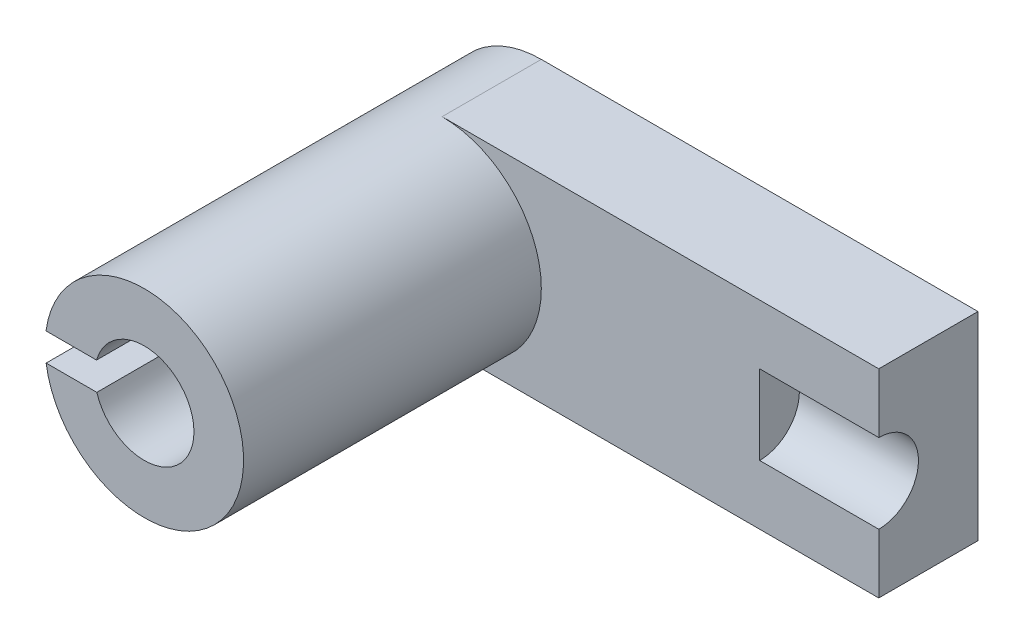
ISO-10303-21;
HEADER;
FILE_DESCRIPTION(('STEP AP214'),'2;1');
FILE_NAME('part.step','',(''),(''),'','','');
FILE_SCHEMA(('AUTOMOTIVE_DESIGN { 1 0 10303 214 1 1 1 1 }'));
ENDSEC;
DATA;
#1=APPLICATION_CONTEXT('core data for automotive mechanical design processes');
#2=APPLICATION_PROTOCOL_DEFINITION('international standard','automotive_design',2000,#1);
#3=PRODUCT_CONTEXT('',#1,'mechanical');
#4=PRODUCT('Part','Part','',(#3));
#5=PRODUCT_RELATED_PRODUCT_CATEGORY('part','',(#4));
#6=PRODUCT_DEFINITION_FORMATION('','',#4);
#7=PRODUCT_DEFINITION_CONTEXT('part definition',#1,'design');
#8=PRODUCT_DEFINITION('design','',#6,#7);
#9=PRODUCT_DEFINITION_SHAPE('','',#8);
#10=(LENGTH_UNIT() NAMED_UNIT(*) SI_UNIT(.MILLI.,.METRE.));
#11=(NAMED_UNIT(*) PLANE_ANGLE_UNIT() SI_UNIT($,.RADIAN.));
#12=(NAMED_UNIT(*) SI_UNIT($,.STERADIAN.) SOLID_ANGLE_UNIT());
#13=UNCERTAINTY_MEASURE_WITH_UNIT(LENGTH_MEASURE(1.E-05),#10,'distance_accuracy_value','');
#14=(GEOMETRIC_REPRESENTATION_CONTEXT(3) GLOBAL_UNCERTAINTY_ASSIGNED_CONTEXT((#13)) GLOBAL_UNIT_ASSIGNED_CONTEXT((#10,
#11,#12)) REPRESENTATION_CONTEXT('',''));
#15=CARTESIAN_POINT('',(0.,0.,0.));
#16=DIRECTION('',(0.,0.,1.));
#17=DIRECTION('',(1.,0.,0.));
#18=AXIS2_PLACEMENT_3D('',#15,#16,#17);
#19=CARTESIAN_POINT('',(-110.,25.,0.));
#20=DIRECTION('',(0.,1.,0.));
#21=DIRECTION('',(0.,0.,1.));
#22=AXIS2_PLACEMENT_3D('',#19,#20,#21);
#23=PLANE('',#22);
#24=DIRECTION('',(0.,0.,1.));
#25=VECTOR('',#24,1.);
#26=CARTESIAN_POINT('',(0.,25.,0.));
#27=LINE('',#26,#25);
#28=CARTESIAN_POINT('',(0.,25.,-12.5));
#29=VERTEX_POINT('',#28);
#30=CARTESIAN_POINT('',(0.,25.,12.5));
#31=VERTEX_POINT('',#30);
#32=EDGE_CURVE('E158',#29,#31,#27,.T.);
#33=ORIENTED_EDGE('',*,*,#32,.F.);
#34=DIRECTION('',(1.,0.,0.));
#35=VECTOR('',#34,1.);
#36=CARTESIAN_POINT('',(-110.,25.,-12.5));
#37=LINE('',#36,#35);
#38=CARTESIAN_POINT('',(-110.,25.,-12.5));
#39=VERTEX_POINT('',#38);
#40=EDGE_CURVE('E175',#39,#29,#37,.T.);
#41=ORIENTED_EDGE('',*,*,#40,.F.);
#42=DIRECTION('',(0.,0.,1.));
#43=VECTOR('',#42,1.);
#44=CARTESIAN_POINT('',(-110.,25.,0.));
#45=LINE('',#44,#43);
#46=CARTESIAN_POINT('',(-110.,25.,12.5));
#47=VERTEX_POINT('',#46);
#48=EDGE_CURVE('E159',#39,#47,#45,.T.);
#49=ORIENTED_EDGE('',*,*,#48,.T.);
#50=DIRECTION('',(1.,0.,0.));
#51=VECTOR('',#50,1.);
#52=CARTESIAN_POINT('',(-110.,25.,12.5));
#53=LINE('',#52,#51);
#54=EDGE_CURVE('E165',#47,#31,#53,.T.);
#55=ORIENTED_EDGE('',*,*,#54,.T.);
#56=EDGE_LOOP('',(#33,#41,#49,#55));
#57=FACE_BOUND('',#56,.T.);
#58=ADVANCED_FACE('F41',(#57),#23,.T.);
#59=CARTESIAN_POINT('',(-110.,0.,-12.5));
#60=DIRECTION('',(0.,0.,1.));
#61=DIRECTION('',(0.,-1.,0.));
#62=AXIS2_PLACEMENT_3D('',#59,#60,#61);
#63=PLANE('',#62);
#64=CARTESIAN_POINT('',(-110.,0.,-12.5));
#65=DIRECTION('',(0.,0.,-1.));
#66=DIRECTION('',(0.,1.,0.));
#67=AXIS2_PLACEMENT_3D('',#64,#65,#66);
#68=CIRCLE('',#67,12.5);
#69=CARTESIAN_POINT('',(-122.033532760525,3.38291136469196,-12.5));
#70=VERTEX_POINT('',#69);
#71=CARTESIAN_POINT('',(-121.965227528314,-3.61708863530804,-12.5));
#72=VERTEX_POINT('',#71);
#73=EDGE_CURVE('E189',#70,#72,#68,.T.);
#74=ORIENTED_EDGE('',*,*,#73,.F.);
#75=DIRECTION('',(-1.,0.,0.));
#76=VECTOR('',#75,1.);
#77=CARTESIAN_POINT('',(-110.,3.38291136469196,-12.5));
#78=LINE('',#77,#76);
#79=CARTESIAN_POINT('',(-134.770060773011,3.38291136469196,-12.5));
#80=VERTEX_POINT('',#79);
#81=EDGE_CURVE('E122',#70,#80,#78,.T.);
#82=ORIENTED_EDGE('',*,*,#81,.T.);
#83=CARTESIAN_POINT('',(-110.,0.,-12.5));
#84=DIRECTION('',(0.,0.,-1.));
#85=DIRECTION('',(0.,1.,0.));
#86=AXIS2_PLACEMENT_3D('',#83,#84,#85);
#87=CIRCLE('',#86,25.);
#88=EDGE_CURVE('E138',#80,#39,#87,.T.);
#89=ORIENTED_EDGE('',*,*,#88,.T.);
#90=ORIENTED_EDGE('',*,*,#40,.T.);
#91=DIRECTION('',(0.,-1.,0.));
#92=VECTOR('',#91,1.);
#93=CARTESIAN_POINT('',(0.,0.,-12.5));
#94=LINE('',#93,#92);
#95=CARTESIAN_POINT('',(0.,-25.,-12.5));
#96=VERTEX_POINT('',#95);
#97=EDGE_CURVE('E163',#29,#96,#94,.T.);
#98=ORIENTED_EDGE('',*,*,#97,.T.);
#99=DIRECTION('',(1.,0.,0.));
#100=VECTOR('',#99,1.);
#101=CARTESIAN_POINT('',(-110.,-25.,-12.5));
#102=LINE('',#101,#100);
#103=CARTESIAN_POINT('',(-110.,-25.,-12.5));
#104=VERTEX_POINT('',#103);
#105=EDGE_CURVE('E136',#104,#96,#102,.T.);
#106=ORIENTED_EDGE('',*,*,#105,.F.);
#107=CARTESIAN_POINT('',(-134.736949484614,-3.61708863530804,-12.5));
#108=VERTEX_POINT('',#107);
#109=EDGE_CURVE('E130',#104,#108,#87,.T.);
#110=ORIENTED_EDGE('',*,*,#109,.T.);
#111=DIRECTION('',(1.,0.,0.));
#112=VECTOR('',#111,1.);
#113=CARTESIAN_POINT('',(-142.203850694216,-3.61708863530804,-12.5));
#114=LINE('',#113,#112);
#115=EDGE_CURVE('E115',#108,#72,#114,.T.);
#116=ORIENTED_EDGE('',*,*,#115,.T.);
#117=EDGE_LOOP('',(#74,#82,#89,#90,#98,#106,#110,#116));
#118=FACE_BOUND('',#117,.T.);
#119=ADVANCED_FACE('F134',(#118),#63,.F.);
#120=CARTESIAN_POINT('',(-110.,-25.,0.));
#121=DIRECTION('',(0.,1.,0.));
#122=DIRECTION('',(0.,0.,1.));
#123=AXIS2_PLACEMENT_3D('',#120,#121,#122);
#124=PLANE('',#123);
#125=DIRECTION('',(0.,0.,1.));
#126=VECTOR('',#125,1.);
#127=CARTESIAN_POINT('',(0.,-25.,0.));
#128=LINE('',#127,#126);
#129=CARTESIAN_POINT('',(0.,-25.,12.5));
#130=VERTEX_POINT('',#129);
#131=EDGE_CURVE('E171',#96,#130,#128,.T.);
#132=ORIENTED_EDGE('',*,*,#131,.T.);
#133=DIRECTION('',(1.,0.,0.));
#134=VECTOR('',#133,1.);
#135=CARTESIAN_POINT('',(-110.,-25.,12.5));
#136=LINE('',#135,#134);
#137=CARTESIAN_POINT('',(-110.,-25.,12.5));
#138=VERTEX_POINT('',#137);
#139=EDGE_CURVE('E179',#138,#130,#136,.T.);
#140=ORIENTED_EDGE('',*,*,#139,.F.);
#141=DIRECTION('',(0.,0.,1.));
#142=VECTOR('',#141,1.);
#143=CARTESIAN_POINT('',(-110.,-25.,0.));
#144=LINE('',#143,#142);
#145=EDGE_CURVE('E162',#104,#138,#144,.T.);
#146=ORIENTED_EDGE('',*,*,#145,.F.);
#147=ORIENTED_EDGE('',*,*,#105,.T.);
#148=EDGE_LOOP('',(#132,#140,#146,#147));
#149=FACE_BOUND('',#148,.T.);
#150=ADVANCED_FACE('F213',(#149),#124,.F.);
#151=CARTESIAN_POINT('',(-110.,0.,12.5));
#152=DIRECTION('',(0.,0.,1.));
#153=DIRECTION('',(0.,-1.,0.));
#154=AXIS2_PLACEMENT_3D('',#151,#152,#153);
#155=PLANE('',#154);
#156=CARTESIAN_POINT('',(-110.,0.,12.5));
#157=DIRECTION('',(0.,0.,1.));
#158=DIRECTION('',(0.,-1.,0.));
#159=AXIS2_PLACEMENT_3D('',#156,#157,#158);
#160=CIRCLE('',#159,25.);
#161=EDGE_CURVE('E140',#138,#47,#160,.T.);
#162=ORIENTED_EDGE('',*,*,#161,.F.);
#163=ORIENTED_EDGE('',*,*,#139,.T.);
#164=DIRECTION('',(0.,-1.,0.));
#165=VECTOR('',#164,1.);
#166=CARTESIAN_POINT('',(0.,0.,12.5));
#167=LINE('',#166,#165);
#168=CARTESIAN_POINT('',(0.,-10.,12.5));
#169=VERTEX_POINT('',#168);
#170=EDGE_CURVE('E168',#169,#130,#167,.T.);
#171=ORIENTED_EDGE('',*,*,#170,.F.);
#172=DIRECTION('',(1.,0.,0.));
#173=VECTOR('',#172,1.);
#174=CARTESIAN_POINT('',(-30.,-10.,12.5));
#175=LINE('',#174,#173);
#176=CARTESIAN_POINT('',(-30.,-10.,12.5));
#177=VERTEX_POINT('',#176);
#178=EDGE_CURVE('E156',#177,#169,#175,.T.);
#179=ORIENTED_EDGE('',*,*,#178,.F.);
#180=DIRECTION('',(0.,-1.,0.));
#181=VECTOR('',#180,1.);
#182=CARTESIAN_POINT('',(-30.,-10.,12.5));
#183=LINE('',#182,#181);
#184=CARTESIAN_POINT('',(-30.,10.,12.5));
#185=VERTEX_POINT('',#184);
#186=EDGE_CURVE('E150',#185,#177,#183,.T.);
#187=ORIENTED_EDGE('',*,*,#186,.F.);
#188=DIRECTION('',(1.,0.,0.));
#189=VECTOR('',#188,1.);
#190=CARTESIAN_POINT('',(-30.,10.,12.5));
#191=LINE('',#190,#189);
#192=CARTESIAN_POINT('',(0.,10.,12.5));
#193=VERTEX_POINT('',#192);
#194=EDGE_CURVE('E153',#185,#193,#191,.T.);
#195=ORIENTED_EDGE('',*,*,#194,.T.);
#196=EDGE_CURVE('E170',#31,#193,#167,.T.);
#197=ORIENTED_EDGE('',*,*,#196,.F.);
#198=ORIENTED_EDGE('',*,*,#54,.F.);
#199=EDGE_LOOP('',(#162,#163,#171,#179,#187,#195,#197,#198));
#200=FACE_BOUND('',#199,.T.);
#201=ADVANCED_FACE('F215',(#200),#155,.T.);
#202=CARTESIAN_POINT('',(0.,0.,0.));
#203=DIRECTION('',(1.,0.,0.));
#204=DIRECTION('',(0.,0.,-1.));
#205=AXIS2_PLACEMENT_3D('',#202,#203,#204);
#206=PLANE('',#205);
#207=CARTESIAN_POINT('',(0.,0.,12.5));
#208=DIRECTION('',(1.,0.,0.));
#209=DIRECTION('',(0.,0.,-1.));
#210=AXIS2_PLACEMENT_3D('',#207,#208,#209);
#211=CIRCLE('',#210,10.);
#212=EDGE_CURVE('E177',#169,#193,#211,.T.);
#213=ORIENTED_EDGE('',*,*,#212,.F.);
#214=ORIENTED_EDGE('',*,*,#170,.T.);
#215=ORIENTED_EDGE('',*,*,#131,.F.);
#216=ORIENTED_EDGE('',*,*,#97,.F.);
#217=ORIENTED_EDGE('',*,*,#32,.T.);
#218=ORIENTED_EDGE('',*,*,#196,.T.);
#219=EDGE_LOOP('',(#213,#214,#215,#216,#217,#218));
#220=FACE_BOUND('',#219,.T.);
#221=ADVANCED_FACE('F208',(#220),#206,.T.);
#222=CARTESIAN_POINT('',(-30.,0.,12.5));
#223=DIRECTION('',(1.,0.,0.));
#224=DIRECTION('',(0.,0.,-1.));
#225=AXIS2_PLACEMENT_3D('',#222,#223,#224);
#226=CYLINDRICAL_SURFACE('',#225,10.);
#227=ORIENTED_EDGE('',*,*,#212,.T.);
#228=ORIENTED_EDGE('',*,*,#194,.F.);
#229=CARTESIAN_POINT('',(-30.,0.,12.5));
#230=DIRECTION('',(1.,0.,0.));
#231=DIRECTION('',(0.,0.,-1.));
#232=AXIS2_PLACEMENT_3D('',#229,#230,#231);
#233=CIRCLE('',#232,10.);
#234=EDGE_CURVE('E147',#177,#185,#233,.T.);
#235=ORIENTED_EDGE('',*,*,#234,.F.);
#236=ORIENTED_EDGE('',*,*,#178,.T.);
#237=EDGE_LOOP('',(#227,#228,#235,#236));
#238=FACE_BOUND('',#237,.T.);
#239=ADVANCED_FACE('F219',(#238),#226,.F.);
#240=CARTESIAN_POINT('',(-30.,0.,12.5));
#241=DIRECTION('',(1.,0.,0.));
#242=DIRECTION('',(0.,0.,-1.));
#243=AXIS2_PLACEMENT_3D('',#240,#241,#242);
#244=PLANE('',#243);
#245=ORIENTED_EDGE('',*,*,#234,.T.);
#246=ORIENTED_EDGE('',*,*,#186,.T.);
#247=EDGE_LOOP('',(#245,#246));
#248=FACE_BOUND('',#247,.T.);
#249=ADVANCED_FACE('F221',(#248),#244,.T.);
#250=CARTESIAN_POINT('',(-110.,0.,87.5));
#251=DIRECTION('',(0.,0.,-1.));
#252=DIRECTION('',(0.,1.,0.));
#253=AXIS2_PLACEMENT_3D('',#250,#251,#252);
#254=CYLINDRICAL_SURFACE('',#253,25.);
#255=DIRECTION('',(0.,0.,-1.));
#256=VECTOR('',#255,1.);
#257=CARTESIAN_POINT('',(-134.770060773011,3.38291136469196,87.5));
#258=LINE('',#257,#256);
#259=CARTESIAN_POINT('',(-134.770060773011,3.38291136469196,87.5));
#260=VERTEX_POINT('',#259);
#261=EDGE_CURVE('E195',#260,#80,#258,.T.);
#262=ORIENTED_EDGE('',*,*,#261,.F.);
#263=CARTESIAN_POINT('',(-110.,0.,87.5));
#264=DIRECTION('',(0.,0.,-1.));
#265=DIRECTION('',(0.,1.,0.));
#266=AXIS2_PLACEMENT_3D('',#263,#264,#265);
#267=CIRCLE('',#266,25.);
#268=CARTESIAN_POINT('',(-134.736949484614,-3.61708863530804,87.5));
#269=VERTEX_POINT('',#268);
#270=EDGE_CURVE('E132',#260,#269,#267,.T.);
#271=ORIENTED_EDGE('',*,*,#270,.T.);
#272=DIRECTION('',(0.,0.,-1.));
#273=VECTOR('',#272,1.);
#274=CARTESIAN_POINT('',(-134.736949484614,-3.61708863530804,87.5));
#275=LINE('',#274,#273);
#276=EDGE_CURVE('E55',#108,#269,#275,.F.);
#277=ORIENTED_EDGE('',*,*,#276,.F.);
#278=ORIENTED_EDGE('',*,*,#109,.F.);
#279=ORIENTED_EDGE('',*,*,#145,.T.);
#280=ORIENTED_EDGE('',*,*,#161,.T.);
#281=ORIENTED_EDGE('',*,*,#48,.F.);
#282=ORIENTED_EDGE('',*,*,#88,.F.);
#283=EDGE_LOOP('',(#262,#271,#277,#278,#279,#280,#281,#282));
#284=FACE_BOUND('',#283,.T.);
#285=ADVANCED_FACE('F128',(#284),#254,.T.);
#286=CARTESIAN_POINT('',(-110.,0.,87.5));
#287=DIRECTION('',(0.,0.,-1.));
#288=DIRECTION('',(0.,1.,0.));
#289=AXIS2_PLACEMENT_3D('',#286,#287,#288);
#290=CYLINDRICAL_SURFACE('',#289,12.5);
#291=CARTESIAN_POINT('',(-110.,0.,87.5));
#292=DIRECTION('',(0.,0.,-1.));
#293=DIRECTION('',(0.,1.,0.));
#294=AXIS2_PLACEMENT_3D('',#291,#292,#293);
#295=CIRCLE('',#294,12.5);
#296=CARTESIAN_POINT('',(-122.033532760525,3.38291136469196,87.5));
#297=VERTEX_POINT('',#296);
#298=CARTESIAN_POINT('',(-121.965227528314,-3.61708863530804,87.5));
#299=VERTEX_POINT('',#298);
#300=EDGE_CURVE('E142',#297,#299,#295,.T.);
#301=ORIENTED_EDGE('',*,*,#300,.F.);
#302=DIRECTION('',(0.,0.,-1.));
#303=VECTOR('',#302,1.);
#304=CARTESIAN_POINT('',(-122.033532760525,3.38291136469196,87.5));
#305=LINE('',#304,#303);
#306=EDGE_CURVE('E63',#297,#70,#305,.T.);
#307=ORIENTED_EDGE('',*,*,#306,.T.);
#308=ORIENTED_EDGE('',*,*,#73,.T.);
#309=DIRECTION('',(0.,0.,-1.));
#310=VECTOR('',#309,1.);
#311=CARTESIAN_POINT('',(-121.965227528314,-3.61708863530804,87.5));
#312=LINE('',#311,#310);
#313=EDGE_CURVE('E118',#72,#299,#312,.F.);
#314=ORIENTED_EDGE('',*,*,#313,.T.);
#315=EDGE_LOOP('',(#301,#307,#308,#314));
#316=FACE_BOUND('',#315,.T.);
#317=ADVANCED_FACE('F188',(#316),#290,.F.);
#318=CARTESIAN_POINT('',(-110.,0.,87.5));
#319=DIRECTION('',(0.,0.,-1.));
#320=DIRECTION('',(0.,1.,0.));
#321=AXIS2_PLACEMENT_3D('',#318,#319,#320);
#322=PLANE('',#321);
#323=ORIENTED_EDGE('',*,*,#270,.F.);
#324=DIRECTION('',(1.,0.,0.));
#325=VECTOR('',#324,1.);
#326=CARTESIAN_POINT('',(-110.,3.38291136469196,87.5));
#327=LINE('',#326,#325);
#328=EDGE_CURVE('E11',#260,#297,#327,.T.);
#329=ORIENTED_EDGE('',*,*,#328,.T.);
#330=ORIENTED_EDGE('',*,*,#300,.T.);
#331=DIRECTION('',(-1.,0.,0.));
#332=VECTOR('',#331,1.);
#333=CARTESIAN_POINT('',(-110.,-3.61708863530804,87.5));
#334=LINE('',#333,#332);
#335=EDGE_CURVE('E48',#299,#269,#334,.T.);
#336=ORIENTED_EDGE('',*,*,#335,.T.);
#337=EDGE_LOOP('',(#323,#329,#330,#336));
#338=FACE_BOUND('',#337,.T.);
#339=ADVANCED_FACE('F185',(#338),#322,.F.);
#340=CARTESIAN_POINT('',(-142.203850694216,-3.61708863530804,-12.5));
#341=DIRECTION('',(0.,-1.,0.));
#342=DIRECTION('',(0.,0.,-1.));
#343=AXIS2_PLACEMENT_3D('',#340,#341,#342);
#344=PLANE('',#343);
#345=ORIENTED_EDGE('',*,*,#276,.T.);
#346=ORIENTED_EDGE('',*,*,#335,.F.);
#347=ORIENTED_EDGE('',*,*,#313,.F.);
#348=ORIENTED_EDGE('',*,*,#115,.F.);
#349=EDGE_LOOP('',(#345,#346,#347,#348));
#350=FACE_BOUND('',#349,.T.);
#351=ADVANCED_FACE('F116',(#350),#344,.F.);
#352=CARTESIAN_POINT('',(-110.,3.38291136469196,-12.5));
#353=DIRECTION('',(0.,1.,0.));
#354=DIRECTION('',(0.,0.,1.));
#355=AXIS2_PLACEMENT_3D('',#352,#353,#354);
#356=PLANE('',#355);
#357=ORIENTED_EDGE('',*,*,#261,.T.);
#358=ORIENTED_EDGE('',*,*,#81,.F.);
#359=ORIENTED_EDGE('',*,*,#306,.F.);
#360=ORIENTED_EDGE('',*,*,#328,.F.);
#361=EDGE_LOOP('',(#357,#358,#359,#360));
#362=FACE_BOUND('',#361,.T.);
#363=ADVANCED_FACE('F197',(#362),#356,.F.);
#364=CLOSED_SHELL('',(#58,#119,#150,#201,#221,#239,#249,#285,#317,#339,#351,#363));
#365=MANIFOLD_SOLID_BREP('B2',#364);
#366=ADVANCED_BREP_SHAPE_REPRESENTATION('',(#18,#365),#14);
#367=SHAPE_DEFINITION_REPRESENTATION(#9,#366);
ENDSEC;
END-ISO-10303-21;
